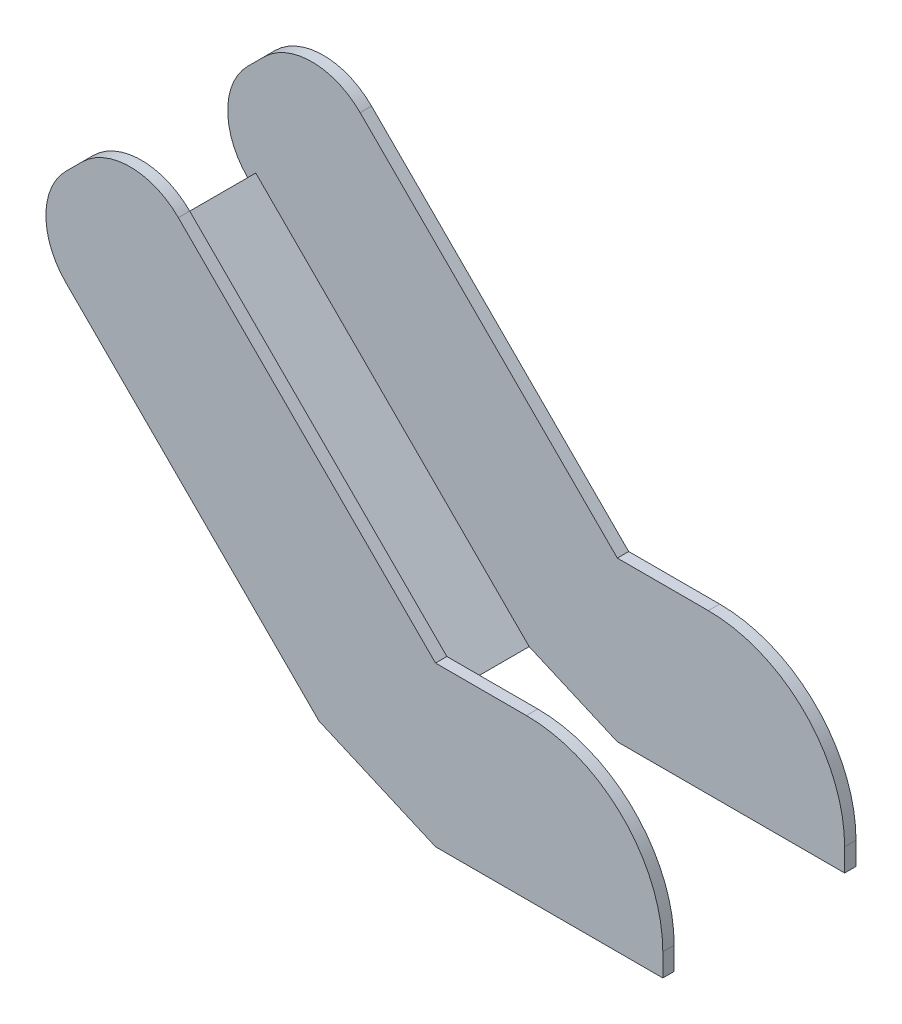
ISO-10303-21;
HEADER;
FILE_DESCRIPTION(('STEP AP214'),'2;1');
FILE_NAME('part.step','',(''),(''),'','','');
FILE_SCHEMA(('AUTOMOTIVE_DESIGN { 1 0 10303 214 1 1 1 1 }'));
ENDSEC;
DATA;
#1=APPLICATION_CONTEXT('core data for automotive mechanical design processes');
#2=APPLICATION_PROTOCOL_DEFINITION('international standard','automotive_design',2000,#1);
#3=PRODUCT_CONTEXT('',#1,'mechanical');
#4=PRODUCT('Part','Part','',(#3));
#5=PRODUCT_RELATED_PRODUCT_CATEGORY('part','',(#4));
#6=PRODUCT_DEFINITION_FORMATION('','',#4);
#7=PRODUCT_DEFINITION_CONTEXT('part definition',#1,'design');
#8=PRODUCT_DEFINITION('design','',#6,#7);
#9=PRODUCT_DEFINITION_SHAPE('','',#8);
#10=(LENGTH_UNIT() NAMED_UNIT(*) SI_UNIT(.MILLI.,.METRE.));
#11=(NAMED_UNIT(*) PLANE_ANGLE_UNIT() SI_UNIT($,.RADIAN.));
#12=(NAMED_UNIT(*) SI_UNIT($,.STERADIAN.) SOLID_ANGLE_UNIT());
#13=UNCERTAINTY_MEASURE_WITH_UNIT(LENGTH_MEASURE(1.E-05),#10,'distance_accuracy_value','');
#14=(GEOMETRIC_REPRESENTATION_CONTEXT(3) GLOBAL_UNCERTAINTY_ASSIGNED_CONTEXT((#13)) GLOBAL_UNIT_ASSIGNED_CONTEXT((#10,
#11,#12)) REPRESENTATION_CONTEXT('',''));
#15=CARTESIAN_POINT('',(0.,0.,0.));
#16=DIRECTION('',(0.,0.,1.));
#17=DIRECTION('',(1.,0.,0.));
#18=AXIS2_PLACEMENT_3D('',#15,#16,#17);
#19=CARTESIAN_POINT('',(-50.,0.,42.5));
#20=DIRECTION('',(-0.707106781186548,-0.707106781186547,0.));
#21=DIRECTION('',(0.707106781186547,-0.707106781186548,0.));
#22=AXIS2_PLACEMENT_3D('',#19,#20,#21);
#23=PLANE('',#22);
#24=DIRECTION('',(-0.707106781186547,0.707106781186548,0.));
#25=VECTOR('',#24,1.);
#26=CARTESIAN_POINT('',(-50.,0.,2.5));
#27=LINE('',#26,#25);
#28=CARTESIAN_POINT('',(-50.,0.,2.5));
#29=VERTEX_POINT('',#28);
#30=CARTESIAN_POINT('',(-106.568542494924,56.5685424949237,2.5));
#31=VERTEX_POINT('',#30);
#32=EDGE_CURVE('E327',#29,#31,#27,.T.);
#33=ORIENTED_EDGE('',*,*,#32,.F.);
#34=DIRECTION('',(0.,0.,-1.));
#35=VECTOR('',#34,1.);
#36=CARTESIAN_POINT('',(-50.,0.,42.5));
#37=LINE('',#36,#35);
#38=CARTESIAN_POINT('',(-50.,0.,0.));
#39=VERTEX_POINT('',#38);
#40=EDGE_CURVE('E97',#29,#39,#37,.T.);
#41=ORIENTED_EDGE('',*,*,#40,.T.);
#42=DIRECTION('',(-0.707106781186547,0.707106781186548,0.));
#43=VECTOR('',#42,1.);
#44=CARTESIAN_POINT('',(-50.,0.,0.));
#45=LINE('',#44,#43);
#46=CARTESIAN_POINT('',(-106.568542494924,56.5685424949237,0.));
#47=VERTEX_POINT('',#46);
#48=EDGE_CURVE('E158',#39,#47,#45,.T.);
#49=ORIENTED_EDGE('',*,*,#48,.T.);
#50=DIRECTION('',(0.,0.,-1.));
#51=VECTOR('',#50,1.);
#52=CARTESIAN_POINT('',(-106.568542494924,56.5685424949237,42.5));
#53=LINE('',#52,#51);
#54=EDGE_CURVE('E41',#31,#47,#53,.T.);
#55=ORIENTED_EDGE('',*,*,#54,.F.);
#56=EDGE_LOOP('',(#33,#41,#49,#55));
#57=FACE_BOUND('',#56,.T.);
#58=ADVANCED_FACE('F33',(#57),#23,.F.);
#59=CARTESIAN_POINT('',(-117.175144212722,45.9619407771256,42.5));
#60=DIRECTION('',(0.,0.,-1.));
#61=DIRECTION('',(-1.,0.,0.));
#62=AXIS2_PLACEMENT_3D('',#59,#60,#61);
#63=CYLINDRICAL_SURFACE('',#62,15.);
#64=CARTESIAN_POINT('',(-117.175144212722,45.9619407771256,2.5));
#65=DIRECTION('',(0.,0.,1.));
#66=DIRECTION('',(1.,0.,0.));
#67=AXIS2_PLACEMENT_3D('',#64,#65,#66);
#68=CIRCLE('',#67,15.);
#69=CARTESIAN_POINT('',(-127.78174593052,56.5685424949237,2.5));
#70=VERTEX_POINT('',#69);
#71=EDGE_CURVE('E330',#31,#70,#68,.T.);
#72=ORIENTED_EDGE('',*,*,#71,.F.);
#73=ORIENTED_EDGE('',*,*,#54,.T.);
#74=CARTESIAN_POINT('',(-117.175144212722,45.9619407771256,0.));
#75=DIRECTION('',(0.,0.,1.));
#76=DIRECTION('',(1.,0.,0.));
#77=AXIS2_PLACEMENT_3D('',#74,#75,#76);
#78=CIRCLE('',#77,15.);
#79=CARTESIAN_POINT('',(-127.78174593052,56.5685424949237,0.));
#80=VERTEX_POINT('',#79);
#81=EDGE_CURVE('E160',#47,#80,#78,.T.);
#82=ORIENTED_EDGE('',*,*,#81,.T.);
#83=DIRECTION('',(0.,0.,-1.));
#84=VECTOR('',#83,1.);
#85=CARTESIAN_POINT('',(-127.78174593052,56.5685424949237,42.5));
#86=LINE('',#85,#84);
#87=EDGE_CURVE('E208',#70,#80,#86,.T.);
#88=ORIENTED_EDGE('',*,*,#87,.F.);
#89=EDGE_LOOP('',(#72,#73,#82,#88));
#90=FACE_BOUND('',#89,.T.);
#91=ADVANCED_FACE('F228',(#90),#63,.T.);
#92=CARTESIAN_POINT('',(-127.78174593052,56.5685424949237,42.5));
#93=DIRECTION('',(0.707106781186548,-0.707106781186547,0.));
#94=DIRECTION('',(0.707106781186547,0.707106781186548,0.));
#95=AXIS2_PLACEMENT_3D('',#92,#93,#94);
#96=PLANE('',#95);
#97=DIRECTION('',(-0.707106781186547,-0.707106781186548,0.));
#98=VECTOR('',#97,1.);
#99=CARTESIAN_POINT('',(-127.78174593052,56.5685424949237,2.5));
#100=LINE('',#99,#98);
#101=CARTESIAN_POINT('',(-131.317279836453,53.0330085889912,2.5));
#102=VERTEX_POINT('',#101);
#103=EDGE_CURVE('E224',#70,#102,#100,.T.);
#104=ORIENTED_EDGE('',*,*,#103,.F.);
#105=ORIENTED_EDGE('',*,*,#87,.T.);
#106=DIRECTION('',(-0.707106781186547,-0.707106781186548,0.));
#107=VECTOR('',#106,1.);
#108=CARTESIAN_POINT('',(-127.78174593052,56.5685424949237,0.));
#109=LINE('',#108,#107);
#110=CARTESIAN_POINT('',(-131.317279836453,53.0330085889912,0.));
#111=VERTEX_POINT('',#110);
#112=EDGE_CURVE('E164',#80,#111,#109,.T.);
#113=ORIENTED_EDGE('',*,*,#112,.T.);
#114=DIRECTION('',(0.,0.,-1.));
#115=VECTOR('',#114,1.);
#116=CARTESIAN_POINT('',(-131.317279836453,53.0330085889912,42.5));
#117=LINE('',#116,#115);
#118=EDGE_CURVE('E205',#102,#111,#117,.T.);
#119=ORIENTED_EDGE('',*,*,#118,.F.);
#120=EDGE_LOOP('',(#104,#105,#113,#119));
#121=FACE_BOUND('',#120,.T.);
#122=ADVANCED_FACE('F218',(#121),#96,.F.);
#123=CARTESIAN_POINT('',(-120.710678118655,42.4264068711929,42.5));
#124=DIRECTION('',(0.,0.,-1.));
#125=DIRECTION('',(-1.,0.,0.));
#126=AXIS2_PLACEMENT_3D('',#123,#124,#125);
#127=CYLINDRICAL_SURFACE('',#126,15.);
#128=CARTESIAN_POINT('',(-120.710678118655,42.4264068711929,2.5));
#129=DIRECTION('',(0.,0.,1.));
#130=DIRECTION('',(1.,0.,0.));
#131=AXIS2_PLACEMENT_3D('',#128,#129,#130);
#132=CIRCLE('',#131,15.);
#133=CARTESIAN_POINT('',(-131.317279836453,31.8198051533946,2.5));
#134=VERTEX_POINT('',#133);
#135=EDGE_CURVE('E242',#102,#134,#132,.T.);
#136=ORIENTED_EDGE('',*,*,#135,.F.);
#137=ORIENTED_EDGE('',*,*,#118,.T.);
#138=CARTESIAN_POINT('',(-120.710678118655,42.4264068711929,0.));
#139=DIRECTION('',(0.,0.,1.));
#140=DIRECTION('',(1.,0.,0.));
#141=AXIS2_PLACEMENT_3D('',#138,#139,#140);
#142=CIRCLE('',#141,15.);
#143=CARTESIAN_POINT('',(-131.317279836453,31.8198051533946,0.));
#144=VERTEX_POINT('',#143);
#145=EDGE_CURVE('E167',#111,#144,#142,.T.);
#146=ORIENTED_EDGE('',*,*,#145,.T.);
#147=DIRECTION('',(0.,0.,-1.));
#148=VECTOR('',#147,1.);
#149=CARTESIAN_POINT('',(-131.317279836453,31.8198051533946,42.5));
#150=LINE('',#149,#148);
#151=EDGE_CURVE('E201',#134,#144,#150,.T.);
#152=ORIENTED_EDGE('',*,*,#151,.F.);
#153=EDGE_LOOP('',(#136,#137,#146,#152));
#154=FACE_BOUND('',#153,.T.);
#155=ADVANCED_FACE('F238',(#154),#127,.T.);
#156=CARTESIAN_POINT('',(-75.6481772064226,-23.8492974766357,42.5));
#157=DIRECTION('',(0.398705696647574,0.917078931968657,0.));
#158=DIRECTION('',(-0.917078931968657,0.398705696647574,0.));
#159=AXIS2_PLACEMENT_3D('',#156,#157,#158);
#160=PLANE('',#159);
#161=DIRECTION('',(0.917078931968657,-0.398705696647574,0.));
#162=VECTOR('',#161,1.);
#163=CARTESIAN_POINT('',(-75.6481772064226,-23.8492974766357,2.5));
#164=LINE('',#163,#162);
#165=CARTESIAN_POINT('',(-69.3932947444,-26.5686460327256,2.5));
#166=VERTEX_POINT('',#165);
#167=CARTESIAN_POINT('',(-50.,-35.,2.5));
#168=VERTEX_POINT('',#167);
#169=EDGE_CURVE('E304',#166,#168,#164,.T.);
#170=ORIENTED_EDGE('',*,*,#169,.F.);
#171=DIRECTION('',(0.,0.,-1.));
#172=VECTOR('',#171,1.);
#173=CARTESIAN_POINT('',(-69.3932947444,-26.5686460327256,42.5));
#174=LINE('',#173,#172);
#175=CARTESIAN_POINT('',(-69.3932947444,-26.5686460327256,40.));
#176=VERTEX_POINT('',#175);
#177=EDGE_CURVE('E289',#176,#166,#174,.T.);
#178=ORIENTED_EDGE('',*,*,#177,.F.);
#179=DIRECTION('',(0.917078931968657,-0.398705696647574,0.));
#180=VECTOR('',#179,1.);
#181=CARTESIAN_POINT('',(-75.6481772064226,-23.8492974766357,40.));
#182=LINE('',#181,#180);
#183=CARTESIAN_POINT('',(-50.,-35.,40.));
#184=VERTEX_POINT('',#183);
#185=EDGE_CURVE('E294',#176,#184,#182,.T.);
#186=ORIENTED_EDGE('',*,*,#185,.T.);
#187=DIRECTION('',(0.,0.,-1.));
#188=VECTOR('',#187,1.);
#189=CARTESIAN_POINT('',(-50.,-35.,42.5));
#190=LINE('',#189,#188);
#191=CARTESIAN_POINT('',(-50.,-35.,42.5));
#192=VERTEX_POINT('',#191);
#193=EDGE_CURVE('E195',#192,#184,#190,.T.);
#194=ORIENTED_EDGE('',*,*,#193,.F.);
#195=DIRECTION('',(0.917078931968657,-0.398705696647574,0.));
#196=VECTOR('',#195,1.);
#197=CARTESIAN_POINT('',(-75.6481772064226,-23.8492974766357,42.5));
#198=LINE('',#197,#196);
#199=CARTESIAN_POINT('',(-75.6481772064226,-23.8492974766357,42.5));
#200=VERTEX_POINT('',#199);
#201=EDGE_CURVE('E358',#200,#192,#198,.T.);
#202=ORIENTED_EDGE('',*,*,#201,.F.);
#203=DIRECTION('',(0.,0.,-1.));
#204=VECTOR('',#203,1.);
#205=CARTESIAN_POINT('',(-75.6481772064226,-23.8492974766357,42.5));
#206=LINE('',#205,#204);
#207=CARTESIAN_POINT('',(-75.6481772064226,-23.8492974766357,0.));
#208=VERTEX_POINT('',#207);
#209=EDGE_CURVE('E198',#200,#208,#206,.T.);
#210=ORIENTED_EDGE('',*,*,#209,.T.);
#211=DIRECTION('',(0.917078931968657,-0.398705696647574,0.));
#212=VECTOR('',#211,1.);
#213=CARTESIAN_POINT('',(-75.6481772064226,-23.8492974766357,0.));
#214=LINE('',#213,#212);
#215=CARTESIAN_POINT('',(-50.,-35.,0.));
#216=VERTEX_POINT('',#215);
#217=EDGE_CURVE('E172',#208,#216,#214,.T.);
#218=ORIENTED_EDGE('',*,*,#217,.T.);
#219=EDGE_CURVE('E194',#168,#216,#190,.T.);
#220=ORIENTED_EDGE('',*,*,#219,.F.);
#221=EDGE_LOOP('',(#170,#178,#186,#194,#202,#210,#218,#220));
#222=FACE_BOUND('',#221,.T.);
#223=ADVANCED_FACE('F301',(#222),#160,.F.);
#224=CARTESIAN_POINT('',(-50.,-35.,42.5));
#225=DIRECTION('',(0.,1.,0.));
#226=DIRECTION('',(0.,0.,1.));
#227=AXIS2_PLACEMENT_3D('',#224,#225,#226);
#228=PLANE('',#227);
#229=DIRECTION('',(1.,0.,0.));
#230=VECTOR('',#229,1.);
#231=CARTESIAN_POINT('',(-50.,-35.,2.5));
#232=LINE('',#231,#230);
#233=CARTESIAN_POINT('',(0.,-35.,2.5));
#234=VERTEX_POINT('',#233);
#235=EDGE_CURVE('E314',#168,#234,#232,.T.);
#236=ORIENTED_EDGE('',*,*,#235,.F.);
#237=ORIENTED_EDGE('',*,*,#219,.T.);
#238=DIRECTION('',(1.,0.,0.));
#239=VECTOR('',#238,1.);
#240=CARTESIAN_POINT('',(-50.,-35.,0.));
#241=LINE('',#240,#239);
#242=CARTESIAN_POINT('',(0.,-35.,0.));
#243=VERTEX_POINT('',#242);
#244=EDGE_CURVE('E175',#216,#243,#241,.T.);
#245=ORIENTED_EDGE('',*,*,#244,.T.);
#246=DIRECTION('',(0.,0.,-1.));
#247=VECTOR('',#246,1.);
#248=CARTESIAN_POINT('',(0.,-35.,42.5));
#249=LINE('',#248,#247);
#250=EDGE_CURVE('E148',#234,#243,#249,.T.);
#251=ORIENTED_EDGE('',*,*,#250,.F.);
#252=EDGE_LOOP('',(#236,#237,#245,#251));
#253=FACE_BOUND('',#252,.T.);
#254=ADVANCED_FACE('F367',(#253),#228,.F.);
#255=CARTESIAN_POINT('',(0.,-35.,42.5));
#256=DIRECTION('',(-1.,0.,0.));
#257=DIRECTION('',(0.,0.,1.));
#258=AXIS2_PLACEMENT_3D('',#255,#256,#257);
#259=PLANE('',#258);
#260=DIRECTION('',(0.,1.,0.));
#261=VECTOR('',#260,1.);
#262=CARTESIAN_POINT('',(0.,-35.,2.5));
#263=LINE('',#262,#261);
#264=CARTESIAN_POINT('',(0.,-30.0000000000002,2.5));
#265=VERTEX_POINT('',#264);
#266=EDGE_CURVE('E318',#234,#265,#263,.T.);
#267=ORIENTED_EDGE('',*,*,#266,.F.);
#268=ORIENTED_EDGE('',*,*,#250,.T.);
#269=DIRECTION('',(0.,1.,0.));
#270=VECTOR('',#269,1.);
#271=CARTESIAN_POINT('',(0.,-35.,0.));
#272=LINE('',#271,#270);
#273=CARTESIAN_POINT('',(0.,-30.0000000000002,0.));
#274=VERTEX_POINT('',#273);
#275=EDGE_CURVE('E178',#243,#274,#272,.T.);
#276=ORIENTED_EDGE('',*,*,#275,.T.);
#277=DIRECTION('',(0.,0.,-1.));
#278=VECTOR('',#277,1.);
#279=CARTESIAN_POINT('',(0.,-30.0000000000002,42.5));
#280=LINE('',#279,#278);
#281=EDGE_CURVE('E149',#265,#274,#280,.T.);
#282=ORIENTED_EDGE('',*,*,#281,.F.);
#283=EDGE_LOOP('',(#267,#268,#276,#282));
#284=FACE_BOUND('',#283,.T.);
#285=ADVANCED_FACE('F373',(#284),#259,.F.);
#286=CARTESIAN_POINT('',(-30.,-30.,42.5));
#287=DIRECTION('',(0.,0.,-1.));
#288=DIRECTION('',(-1.,0.,0.));
#289=AXIS2_PLACEMENT_3D('',#286,#287,#288);
#290=CYLINDRICAL_SURFACE('',#289,30.);
#291=CARTESIAN_POINT('',(-30.,-30.,2.5));
#292=DIRECTION('',(0.,0.,1.));
#293=DIRECTION('',(1.,0.,0.));
#294=AXIS2_PLACEMENT_3D('',#291,#292,#293);
#295=CIRCLE('',#294,30.);
#296=CARTESIAN_POINT('',(-30.0000000000002,0.,2.5));
#297=VERTEX_POINT('',#296);
#298=EDGE_CURVE('E321',#265,#297,#295,.T.);
#299=ORIENTED_EDGE('',*,*,#298,.F.);
#300=ORIENTED_EDGE('',*,*,#281,.T.);
#301=CARTESIAN_POINT('',(-30.,-30.,0.));
#302=DIRECTION('',(0.,0.,1.));
#303=DIRECTION('',(-1.,0.,0.));
#304=AXIS2_PLACEMENT_3D('',#301,#302,#303);
#305=CIRCLE('',#304,30.);
#306=CARTESIAN_POINT('',(-30.0000000000002,0.,0.));
#307=VERTEX_POINT('',#306);
#308=EDGE_CURVE('E181',#274,#307,#305,.T.);
#309=ORIENTED_EDGE('',*,*,#308,.T.);
#310=DIRECTION('',(0.,0.,-1.));
#311=VECTOR('',#310,1.);
#312=CARTESIAN_POINT('',(-30.0000000000002,0.,42.5));
#313=LINE('',#312,#311);
#314=EDGE_CURVE('E190',#297,#307,#313,.T.);
#315=ORIENTED_EDGE('',*,*,#314,.F.);
#316=EDGE_LOOP('',(#299,#300,#309,#315));
#317=FACE_BOUND('',#316,.T.);
#318=ADVANCED_FACE('F393',(#317),#290,.T.);
#319=CARTESIAN_POINT('',(-30.0000000000002,0.,42.5));
#320=DIRECTION('',(0.,-1.,0.));
#321=DIRECTION('',(1.,0.,0.));
#322=AXIS2_PLACEMENT_3D('',#319,#320,#321);
#323=PLANE('',#322);
#324=DIRECTION('',(-1.,0.,0.));
#325=VECTOR('',#324,1.);
#326=CARTESIAN_POINT('',(-30.0000000000002,0.,2.5));
#327=LINE('',#326,#325);
#328=EDGE_CURVE('E324',#297,#29,#327,.T.);
#329=ORIENTED_EDGE('',*,*,#328,.F.);
#330=ORIENTED_EDGE('',*,*,#314,.T.);
#331=DIRECTION('',(-1.,0.,0.));
#332=VECTOR('',#331,1.);
#333=CARTESIAN_POINT('',(-30.0000000000002,0.,0.));
#334=LINE('',#333,#332);
#335=EDGE_CURVE('E184',#307,#39,#334,.T.);
#336=ORIENTED_EDGE('',*,*,#335,.T.);
#337=ORIENTED_EDGE('',*,*,#40,.F.);
#338=EDGE_LOOP('',(#329,#330,#336,#337));
#339=FACE_BOUND('',#338,.T.);
#340=ADVANCED_FACE('F386',(#339),#323,.F.);
#341=CARTESIAN_POINT('',(-50.,0.,42.5));
#342=VERTEX_POINT('',#341);
#343=CARTESIAN_POINT('',(-50.,0.,40.));
#344=VERTEX_POINT('',#343);
#345=EDGE_CURVE('E187',#342,#344,#37,.T.);
#346=ORIENTED_EDGE('',*,*,#345,.T.);
#347=DIRECTION('',(-0.707106781186547,0.707106781186548,0.));
#348=VECTOR('',#347,1.);
#349=CARTESIAN_POINT('',(-50.,0.,40.));
#350=LINE('',#349,#348);
#351=CARTESIAN_POINT('',(-106.568542494924,56.5685424949237,40.));
#352=VERTEX_POINT('',#351);
#353=EDGE_CURVE('E48',#344,#352,#350,.T.);
#354=ORIENTED_EDGE('',*,*,#353,.T.);
#355=CARTESIAN_POINT('',(-106.568542494924,56.5685424949237,42.5));
#356=VERTEX_POINT('',#355);
#357=EDGE_CURVE('E11',#356,#352,#53,.T.);
#358=ORIENTED_EDGE('',*,*,#357,.F.);
#359=DIRECTION('',(-0.707106781186547,0.707106781186548,0.));
#360=VECTOR('',#359,1.);
#361=CARTESIAN_POINT('',(-50.,0.,42.5));
#362=LINE('',#361,#360);
#363=EDGE_CURVE('E186',#342,#356,#362,.T.);
#364=ORIENTED_EDGE('',*,*,#363,.F.);
#365=EDGE_LOOP('',(#346,#354,#358,#364));
#366=FACE_BOUND('',#365,.T.);
#367=ADVANCED_FACE('F35',(#366),#23,.F.);
#368=ORIENTED_EDGE('',*,*,#357,.T.);
#369=CARTESIAN_POINT('',(-117.175144212722,45.9619407771256,40.));
#370=DIRECTION('',(0.,0.,1.));
#371=DIRECTION('',(1.,0.,0.));
#372=AXIS2_PLACEMENT_3D('',#369,#370,#371);
#373=CIRCLE('',#372,15.);
#374=CARTESIAN_POINT('',(-127.78174593052,56.5685424949237,40.));
#375=VERTEX_POINT('',#374);
#376=EDGE_CURVE('E343',#352,#375,#373,.T.);
#377=ORIENTED_EDGE('',*,*,#376,.T.);
#378=CARTESIAN_POINT('',(-127.78174593052,56.5685424949237,42.5));
#379=VERTEX_POINT('',#378);
#380=EDGE_CURVE('E209',#379,#375,#86,.T.);
#381=ORIENTED_EDGE('',*,*,#380,.F.);
#382=CARTESIAN_POINT('',(-117.175144212722,45.9619407771256,42.5));
#383=DIRECTION('',(0.,0.,1.));
#384=DIRECTION('',(1.,0.,0.));
#385=AXIS2_PLACEMENT_3D('',#382,#383,#384);
#386=CIRCLE('',#385,15.);
#387=EDGE_CURVE('E105',#356,#379,#386,.T.);
#388=ORIENTED_EDGE('',*,*,#387,.F.);
#389=EDGE_LOOP('',(#368,#377,#381,#388));
#390=FACE_BOUND('',#389,.T.);
#391=ADVANCED_FACE('F384',(#390),#63,.T.);
#392=ORIENTED_EDGE('',*,*,#380,.T.);
#393=DIRECTION('',(-0.707106781186547,-0.707106781186548,0.));
#394=VECTOR('',#393,1.);
#395=CARTESIAN_POINT('',(-127.78174593052,56.5685424949237,40.));
#396=LINE('',#395,#394);
#397=CARTESIAN_POINT('',(-131.317279836453,53.0330085889912,40.));
#398=VERTEX_POINT('',#397);
#399=EDGE_CURVE('E341',#375,#398,#396,.T.);
#400=ORIENTED_EDGE('',*,*,#399,.T.);
#401=CARTESIAN_POINT('',(-131.317279836453,53.0330085889912,42.5));
#402=VERTEX_POINT('',#401);
#403=EDGE_CURVE('E206',#402,#398,#117,.T.);
#404=ORIENTED_EDGE('',*,*,#403,.F.);
#405=DIRECTION('',(-0.707106781186547,-0.707106781186548,0.));
#406=VECTOR('',#405,1.);
#407=CARTESIAN_POINT('',(-127.78174593052,56.5685424949237,42.5));
#408=LINE('',#407,#406);
#409=EDGE_CURVE('E352',#379,#402,#408,.T.);
#410=ORIENTED_EDGE('',*,*,#409,.F.);
#411=EDGE_LOOP('',(#392,#400,#404,#410));
#412=FACE_BOUND('',#411,.T.);
#413=ADVANCED_FACE('F392',(#412),#96,.F.);
#414=ORIENTED_EDGE('',*,*,#403,.T.);
#415=CARTESIAN_POINT('',(-120.710678118655,42.4264068711929,40.));
#416=DIRECTION('',(0.,0.,1.));
#417=DIRECTION('',(1.,0.,0.));
#418=AXIS2_PLACEMENT_3D('',#415,#416,#417);
#419=CIRCLE('',#418,15.);
#420=CARTESIAN_POINT('',(-131.317279836453,31.8198051533946,40.));
#421=VERTEX_POINT('',#420);
#422=EDGE_CURVE('E295',#398,#421,#419,.T.);
#423=ORIENTED_EDGE('',*,*,#422,.T.);
#424=CARTESIAN_POINT('',(-131.317279836453,31.8198051533946,42.5));
#425=VERTEX_POINT('',#424);
#426=EDGE_CURVE('E202',#425,#421,#150,.T.);
#427=ORIENTED_EDGE('',*,*,#426,.F.);
#428=CARTESIAN_POINT('',(-120.710678118655,42.4264068711929,42.5));
#429=DIRECTION('',(0.,0.,1.));
#430=DIRECTION('',(1.,0.,0.));
#431=AXIS2_PLACEMENT_3D('',#428,#429,#430);
#432=CIRCLE('',#431,15.);
#433=EDGE_CURVE('E354',#402,#425,#432,.T.);
#434=ORIENTED_EDGE('',*,*,#433,.F.);
#435=EDGE_LOOP('',(#414,#423,#427,#434));
#436=FACE_BOUND('',#435,.T.);
#437=ADVANCED_FACE('F374',(#436),#127,.T.);
#438=CARTESIAN_POINT('',(-131.317279836453,31.8198051533946,42.5));
#439=DIRECTION('',(0.707106781186547,0.707106781186548,0.));
#440=DIRECTION('',(-0.707106781186548,0.707106781186547,0.));
#441=AXIS2_PLACEMENT_3D('',#438,#439,#440);
#442=PLANE('',#441);
#443=DIRECTION('',(0.707106781186548,-0.707106781186547,0.));
#444=VECTOR('',#443,1.);
#445=CARTESIAN_POINT('',(-131.317279836453,31.8198051533946,0.));
#446=LINE('',#445,#444);
#447=EDGE_CURVE('E170',#144,#208,#446,.T.);
#448=ORIENTED_EDGE('',*,*,#447,.T.);
#449=ORIENTED_EDGE('',*,*,#209,.F.);
#450=DIRECTION('',(0.707106781186548,-0.707106781186547,0.));
#451=VECTOR('',#450,1.);
#452=CARTESIAN_POINT('',(-131.317279836453,31.8198051533946,42.5));
#453=LINE('',#452,#451);
#454=EDGE_CURVE('E356',#425,#200,#453,.T.);
#455=ORIENTED_EDGE('',*,*,#454,.F.);
#456=ORIENTED_EDGE('',*,*,#426,.T.);
#457=DIRECTION('',(0.,0.,-1.));
#458=VECTOR('',#457,1.);
#459=CARTESIAN_POINT('',(-131.317279836453,31.8198051533946,42.5));
#460=LINE('',#459,#458);
#461=EDGE_CURVE('E305',#421,#134,#460,.T.);
#462=ORIENTED_EDGE('',*,*,#461,.T.);
#463=ORIENTED_EDGE('',*,*,#151,.T.);
#464=EDGE_LOOP('',(#448,#449,#455,#456,#462,#463));
#465=FACE_BOUND('',#464,.T.);
#466=ADVANCED_FACE('F365',(#465),#442,.F.);
#467=ORIENTED_EDGE('',*,*,#193,.T.);
#468=DIRECTION('',(1.,0.,0.));
#469=VECTOR('',#468,1.);
#470=CARTESIAN_POINT('',(-50.,-35.,40.));
#471=LINE('',#470,#469);
#472=CARTESIAN_POINT('',(0.,-35.,40.));
#473=VERTEX_POINT('',#472);
#474=EDGE_CURVE('E278',#184,#473,#471,.T.);
#475=ORIENTED_EDGE('',*,*,#474,.T.);
#476=CARTESIAN_POINT('',(0.,-35.,42.5));
#477=VERTEX_POINT('',#476);
#478=EDGE_CURVE('E192',#477,#473,#249,.T.);
#479=ORIENTED_EDGE('',*,*,#478,.F.);
#480=DIRECTION('',(1.,0.,0.));
#481=VECTOR('',#480,1.);
#482=CARTESIAN_POINT('',(-50.,-35.,42.5));
#483=LINE('',#482,#481);
#484=EDGE_CURVE('E134',#192,#477,#483,.T.);
#485=ORIENTED_EDGE('',*,*,#484,.F.);
#486=EDGE_LOOP('',(#467,#475,#479,#485));
#487=FACE_BOUND('',#486,.T.);
#488=ADVANCED_FACE('F363',(#487),#228,.F.);
#489=ORIENTED_EDGE('',*,*,#478,.T.);
#490=DIRECTION('',(0.,1.,0.));
#491=VECTOR('',#490,1.);
#492=CARTESIAN_POINT('',(0.,-35.,40.));
#493=LINE('',#492,#491);
#494=CARTESIAN_POINT('',(0.,-30.0000000000002,40.));
#495=VERTEX_POINT('',#494);
#496=EDGE_CURVE('E145',#473,#495,#493,.T.);
#497=ORIENTED_EDGE('',*,*,#496,.T.);
#498=CARTESIAN_POINT('',(0.,-30.0000000000002,42.5));
#499=VERTEX_POINT('',#498);
#500=EDGE_CURVE('E141',#499,#495,#280,.T.);
#501=ORIENTED_EDGE('',*,*,#500,.F.);
#502=DIRECTION('',(0.,1.,0.));
#503=VECTOR('',#502,1.);
#504=CARTESIAN_POINT('',(0.,-35.,42.5));
#505=LINE('',#504,#503);
#506=EDGE_CURVE('E127',#477,#499,#505,.T.);
#507=ORIENTED_EDGE('',*,*,#506,.F.);
#508=EDGE_LOOP('',(#489,#497,#501,#507));
#509=FACE_BOUND('',#508,.T.);
#510=ADVANCED_FACE('F142',(#509),#259,.F.);
#511=ORIENTED_EDGE('',*,*,#500,.T.);
#512=CARTESIAN_POINT('',(-30.,-30.,40.));
#513=DIRECTION('',(0.,0.,1.));
#514=DIRECTION('',(1.,0.,0.));
#515=AXIS2_PLACEMENT_3D('',#512,#513,#514);
#516=CIRCLE('',#515,30.);
#517=CARTESIAN_POINT('',(-30.0000000000002,0.,40.));
#518=VERTEX_POINT('',#517);
#519=EDGE_CURVE('E309',#495,#518,#516,.T.);
#520=ORIENTED_EDGE('',*,*,#519,.T.);
#521=CARTESIAN_POINT('',(-30.0000000000002,0.,42.5));
#522=VERTEX_POINT('',#521);
#523=EDGE_CURVE('E153',#522,#518,#313,.T.);
#524=ORIENTED_EDGE('',*,*,#523,.F.);
#525=CARTESIAN_POINT('',(-30.,-30.,42.5));
#526=DIRECTION('',(0.,0.,1.));
#527=DIRECTION('',(-1.,0.,0.));
#528=AXIS2_PLACEMENT_3D('',#525,#526,#527);
#529=CIRCLE('',#528,30.);
#530=EDGE_CURVE('E131',#499,#522,#529,.T.);
#531=ORIENTED_EDGE('',*,*,#530,.F.);
#532=EDGE_LOOP('',(#511,#520,#524,#531));
#533=FACE_BOUND('',#532,.T.);
#534=ADVANCED_FACE('F151',(#533),#290,.T.);
#535=ORIENTED_EDGE('',*,*,#523,.T.);
#536=DIRECTION('',(-1.,0.,0.));
#537=VECTOR('',#536,1.);
#538=CARTESIAN_POINT('',(-30.0000000000002,0.,40.));
#539=LINE('',#538,#537);
#540=EDGE_CURVE('E306',#518,#344,#539,.T.);
#541=ORIENTED_EDGE('',*,*,#540,.T.);
#542=ORIENTED_EDGE('',*,*,#345,.F.);
#543=DIRECTION('',(-1.,0.,0.));
#544=VECTOR('',#543,1.);
#545=CARTESIAN_POINT('',(-30.0000000000002,0.,42.5));
#546=LINE('',#545,#544);
#547=EDGE_CURVE('E57',#522,#342,#546,.T.);
#548=ORIENTED_EDGE('',*,*,#547,.F.);
#549=EDGE_LOOP('',(#535,#541,#542,#548));
#550=FACE_BOUND('',#549,.T.);
#551=ADVANCED_FACE('F396',(#550),#323,.F.);
#552=CARTESIAN_POINT('',(-117.175144212722,45.9619407771256,42.5));
#553=DIRECTION('',(0.,0.,1.));
#554=DIRECTION('',(1.,0.,0.));
#555=AXIS2_PLACEMENT_3D('',#552,#553,#554);
#556=PLANE('',#555);
#557=ORIENTED_EDGE('',*,*,#363,.T.);
#558=ORIENTED_EDGE('',*,*,#387,.T.);
#559=ORIENTED_EDGE('',*,*,#409,.T.);
#560=ORIENTED_EDGE('',*,*,#433,.T.);
#561=ORIENTED_EDGE('',*,*,#454,.T.);
#562=ORIENTED_EDGE('',*,*,#201,.T.);
#563=ORIENTED_EDGE('',*,*,#484,.T.);
#564=ORIENTED_EDGE('',*,*,#506,.T.);
#565=ORIENTED_EDGE('',*,*,#530,.T.);
#566=ORIENTED_EDGE('',*,*,#547,.T.);
#567=EDGE_LOOP('',(#557,#558,#559,#560,#561,#562,#563,#564,#565,#566));
#568=FACE_BOUND('',#567,.T.);
#569=ADVANCED_FACE('F129',(#568),#556,.T.);
#570=CARTESIAN_POINT('',(-117.175144212722,45.9619407771256,0.));
#571=DIRECTION('',(0.,0.,1.));
#572=DIRECTION('',(1.,0.,0.));
#573=AXIS2_PLACEMENT_3D('',#570,#571,#572);
#574=PLANE('',#573);
#575=ORIENTED_EDGE('',*,*,#48,.F.);
#576=ORIENTED_EDGE('',*,*,#335,.F.);
#577=ORIENTED_EDGE('',*,*,#308,.F.);
#578=ORIENTED_EDGE('',*,*,#275,.F.);
#579=ORIENTED_EDGE('',*,*,#244,.F.);
#580=ORIENTED_EDGE('',*,*,#217,.F.);
#581=ORIENTED_EDGE('',*,*,#447,.F.);
#582=ORIENTED_EDGE('',*,*,#145,.F.);
#583=ORIENTED_EDGE('',*,*,#112,.F.);
#584=ORIENTED_EDGE('',*,*,#81,.F.);
#585=EDGE_LOOP('',(#575,#576,#577,#578,#579,#580,#581,#582,#583,#584));
#586=FACE_BOUND('',#585,.T.);
#587=ADVANCED_FACE('F232',(#586),#574,.F.);
#588=CARTESIAN_POINT('',(-131.317279836453,31.8198051533946,21.25));
#589=DIRECTION('',(-0.707106781186552,0.707106781186543,0.));
#590=DIRECTION('',(0.,0.,-1.));
#591=AXIS2_PLACEMENT_3D('',#588,#589,#590);
#592=PLANE('',#591);
#593=ORIENTED_EDGE('',*,*,#461,.F.);
#594=DIRECTION('',(0.707106781186543,0.707106781186552,0.));
#595=VECTOR('',#594,1.);
#596=CARTESIAN_POINT('',(-131.317279836453,31.8198051533946,40.));
#597=LINE('',#596,#595);
#598=CARTESIAN_POINT('',(-129.549512883487,33.587572106361,40.));
#599=VERTEX_POINT('',#598);
#600=EDGE_CURVE('E336',#599,#421,#597,.F.);
#601=ORIENTED_EDGE('',*,*,#600,.F.);
#602=DIRECTION('',(0.,0.,1.));
#603=VECTOR('',#602,1.);
#604=CARTESIAN_POINT('',(-129.549512883487,33.587572106361,42.5));
#605=LINE('',#604,#603);
#606=CARTESIAN_POINT('',(-129.549512883487,33.587572106361,2.5));
#607=VERTEX_POINT('',#606);
#608=EDGE_CURVE('E292',#599,#607,#605,.F.);
#609=ORIENTED_EDGE('',*,*,#608,.T.);
#610=DIRECTION('',(0.707106781186543,0.707106781186552,0.));
#611=VECTOR('',#610,1.);
#612=CARTESIAN_POINT('',(-131.317279836453,31.8198051533946,2.5));
#613=LINE('',#612,#611);
#614=EDGE_CURVE('E161',#607,#134,#613,.F.);
#615=ORIENTED_EDGE('',*,*,#614,.T.);
#616=EDGE_LOOP('',(#593,#601,#609,#615));
#617=FACE_BOUND('',#616,.T.);
#618=ADVANCED_FACE('F409',(#617),#592,.T.);
#619=CARTESIAN_POINT('',(-129.549512883487,33.5875721063609,42.5));
#620=DIRECTION('',(0.707106781186547,0.707106781186548,0.));
#621=DIRECTION('',(-0.707106781186548,0.707106781186547,0.));
#622=AXIS2_PLACEMENT_3D('',#619,#620,#621);
#623=PLANE('',#622);
#624=DIRECTION('',(0.707106781186548,-0.707106781186547,0.));
#625=VECTOR('',#624,1.);
#626=CARTESIAN_POINT('',(-129.549512883487,33.5875721063609,2.5));
#627=LINE('',#626,#625);
#628=EDGE_CURVE('E315',#607,#166,#627,.T.);
#629=ORIENTED_EDGE('',*,*,#628,.F.);
#630=ORIENTED_EDGE('',*,*,#608,.F.);
#631=DIRECTION('',(0.707106781186548,-0.707106781186547,0.));
#632=VECTOR('',#631,1.);
#633=CARTESIAN_POINT('',(-129.549512883487,33.5875721063609,40.));
#634=LINE('',#633,#632);
#635=EDGE_CURVE('E285',#599,#176,#634,.T.);
#636=ORIENTED_EDGE('',*,*,#635,.T.);
#637=ORIENTED_EDGE('',*,*,#177,.T.);
#638=EDGE_LOOP('',(#629,#630,#636,#637));
#639=FACE_BOUND('',#638,.T.);
#640=ADVANCED_FACE('F287',(#639),#623,.T.);
#641=CARTESIAN_POINT('',(-117.175144212722,45.9619407771256,40.));
#642=DIRECTION('',(0.,0.,1.));
#643=DIRECTION('',(1.,0.,0.));
#644=AXIS2_PLACEMENT_3D('',#641,#642,#643);
#645=PLANE('',#644);
#646=ORIENTED_EDGE('',*,*,#353,.F.);
#647=ORIENTED_EDGE('',*,*,#540,.F.);
#648=ORIENTED_EDGE('',*,*,#519,.F.);
#649=ORIENTED_EDGE('',*,*,#496,.F.);
#650=ORIENTED_EDGE('',*,*,#474,.F.);
#651=ORIENTED_EDGE('',*,*,#185,.F.);
#652=ORIENTED_EDGE('',*,*,#635,.F.);
#653=ORIENTED_EDGE('',*,*,#600,.T.);
#654=ORIENTED_EDGE('',*,*,#422,.F.);
#655=ORIENTED_EDGE('',*,*,#399,.F.);
#656=ORIENTED_EDGE('',*,*,#376,.F.);
#657=EDGE_LOOP('',(#646,#647,#648,#649,#650,#651,#652,#653,#654,#655,#656));
#658=FACE_BOUND('',#657,.T.);
#659=ADVANCED_FACE('F297',(#658),#645,.F.);
#660=CARTESIAN_POINT('',(-117.175144212722,45.9619407771256,2.5));
#661=DIRECTION('',(0.,0.,1.));
#662=DIRECTION('',(1.,0.,0.));
#663=AXIS2_PLACEMENT_3D('',#660,#661,#662);
#664=PLANE('',#663);
#665=ORIENTED_EDGE('',*,*,#32,.T.);
#666=ORIENTED_EDGE('',*,*,#71,.T.);
#667=ORIENTED_EDGE('',*,*,#103,.T.);
#668=ORIENTED_EDGE('',*,*,#135,.T.);
#669=ORIENTED_EDGE('',*,*,#614,.F.);
#670=ORIENTED_EDGE('',*,*,#628,.T.);
#671=ORIENTED_EDGE('',*,*,#169,.T.);
#672=ORIENTED_EDGE('',*,*,#235,.T.);
#673=ORIENTED_EDGE('',*,*,#266,.T.);
#674=ORIENTED_EDGE('',*,*,#298,.T.);
#675=ORIENTED_EDGE('',*,*,#328,.T.);
#676=EDGE_LOOP('',(#665,#666,#667,#668,#669,#670,#671,#672,#673,#674,#675));
#677=FACE_BOUND('',#676,.T.);
#678=ADVANCED_FACE('F411',(#677),#664,.T.);
#679=CLOSED_SHELL('',(#58,#91,#122,#155,#223,#254,#285,#318,#340,#367,#391,#413,#437,#466,#488,
#510,#534,#551,#569,#587,#618,#640,#659,#678));
#680=MANIFOLD_SOLID_BREP('B2',#679);
#681=ADVANCED_BREP_SHAPE_REPRESENTATION('',(#18,#680),#14);
#682=SHAPE_DEFINITION_REPRESENTATION(#9,#681);
ENDSEC;
END-ISO-10303-21;
